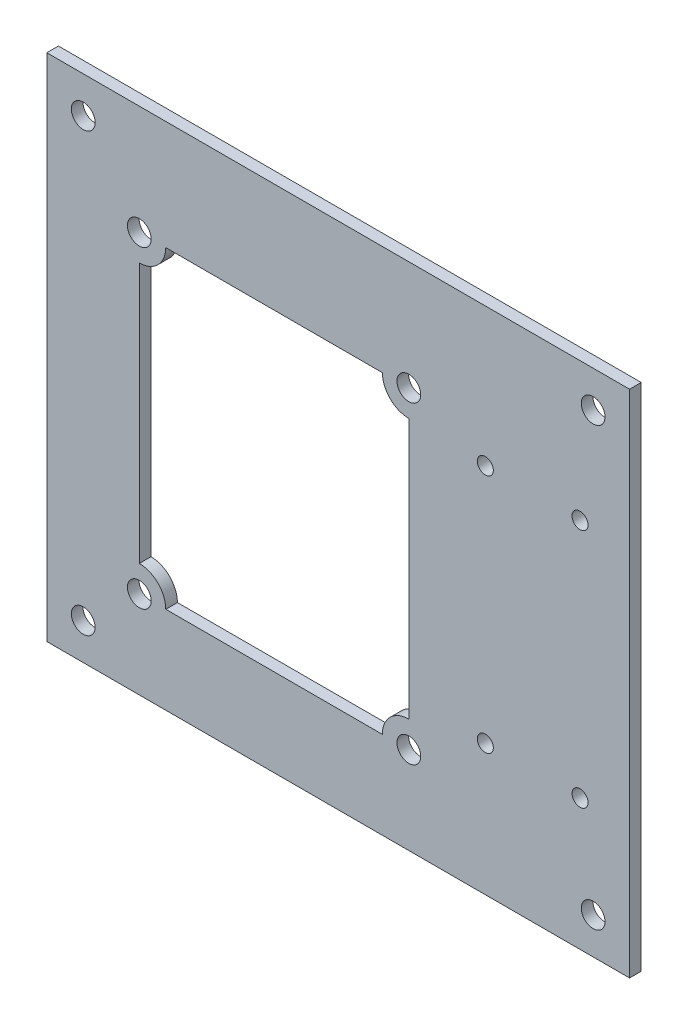
ISO-10303-21;
HEADER;
FILE_DESCRIPTION(('STEP AP214'),'2;1');
FILE_NAME('part.step','',(''),(''),'','','');
FILE_SCHEMA(('AUTOMOTIVE_DESIGN { 1 0 10303 214 1 1 1 1 }'));
ENDSEC;
DATA;
#1=APPLICATION_CONTEXT('core data for automotive mechanical design processes');
#2=APPLICATION_PROTOCOL_DEFINITION('international standard','automotive_design',2000,#1);
#3=PRODUCT_CONTEXT('',#1,'mechanical');
#4=PRODUCT('Part','Part','',(#3));
#5=PRODUCT_RELATED_PRODUCT_CATEGORY('part','',(#4));
#6=PRODUCT_DEFINITION_FORMATION('','',#4);
#7=PRODUCT_DEFINITION_CONTEXT('part definition',#1,'design');
#8=PRODUCT_DEFINITION('design','',#6,#7);
#9=PRODUCT_DEFINITION_SHAPE('','',#8);
#10=(LENGTH_UNIT() NAMED_UNIT(*) SI_UNIT(.MILLI.,.METRE.));
#11=(NAMED_UNIT(*) PLANE_ANGLE_UNIT() SI_UNIT($,.RADIAN.));
#12=(NAMED_UNIT(*) SI_UNIT($,.STERADIAN.) SOLID_ANGLE_UNIT());
#13=UNCERTAINTY_MEASURE_WITH_UNIT(LENGTH_MEASURE(1.E-05),#10,'distance_accuracy_value','');
#14=(GEOMETRIC_REPRESENTATION_CONTEXT(3) GLOBAL_UNCERTAINTY_ASSIGNED_CONTEXT((#13)) GLOBAL_UNIT_ASSIGNED_CONTEXT((#10,
#11,#12)) REPRESENTATION_CONTEXT('',''));
#15=CARTESIAN_POINT('',(0.,0.,0.));
#16=DIRECTION('',(0.,0.,1.));
#17=DIRECTION('',(1.,0.,0.));
#18=AXIS2_PLACEMENT_3D('',#15,#16,#17);
#19=CARTESIAN_POINT('',(75.,0.,1.6));
#20=DIRECTION('',(1.,0.,0.));
#21=DIRECTION('',(0.,1.,0.));
#22=AXIS2_PLACEMENT_3D('',#19,#20,#21);
#23=PLANE('',#22);
#24=DIRECTION('',(0.,-1.,0.));
#25=VECTOR('',#24,1.);
#26=CARTESIAN_POINT('',(75.,0.,0.));
#27=LINE('',#26,#25);
#28=CARTESIAN_POINT('',(75.,5.,0.));
#29=VERTEX_POINT('',#28);
#30=CARTESIAN_POINT('',(75.,-65.,0.));
#31=VERTEX_POINT('',#30);
#32=EDGE_CURVE('E256',#29,#31,#27,.T.);
#33=ORIENTED_EDGE('',*,*,#32,.F.);
#34=DIRECTION('',(0.,0.,-1.));
#35=VECTOR('',#34,1.);
#36=CARTESIAN_POINT('',(75.,5.,1.6));
#37=LINE('',#36,#35);
#38=CARTESIAN_POINT('',(75.,5.,1.6));
#39=VERTEX_POINT('',#38);
#40=EDGE_CURVE('E11',#39,#29,#37,.T.);
#41=ORIENTED_EDGE('',*,*,#40,.F.);
#42=DIRECTION('',(0.,-1.,0.));
#43=VECTOR('',#42,1.);
#44=CARTESIAN_POINT('',(75.,0.,1.6));
#45=LINE('',#44,#43);
#46=CARTESIAN_POINT('',(75.,-65.,1.6));
#47=VERTEX_POINT('',#46);
#48=EDGE_CURVE('E165',#39,#47,#45,.T.);
#49=ORIENTED_EDGE('',*,*,#48,.T.);
#50=DIRECTION('',(0.,0.,-1.));
#51=VECTOR('',#50,1.);
#52=CARTESIAN_POINT('',(75.,-65.,1.6));
#53=LINE('',#52,#51);
#54=EDGE_CURVE('E112',#47,#31,#53,.T.);
#55=ORIENTED_EDGE('',*,*,#54,.T.);
#56=EDGE_LOOP('',(#33,#41,#49,#55));
#57=FACE_BOUND('',#56,.T.);
#58=ADVANCED_FACE('F45',(#57),#23,.T.);
#59=CARTESIAN_POINT('',(0.,5.,1.6));
#60=DIRECTION('',(0.,1.,0.));
#61=DIRECTION('',(0.,0.,1.));
#62=AXIS2_PLACEMENT_3D('',#59,#60,#61);
#63=PLANE('',#62);
#64=DIRECTION('',(1.,0.,0.));
#65=VECTOR('',#64,1.);
#66=CARTESIAN_POINT('',(0.,5.,0.));
#67=LINE('',#66,#65);
#68=CARTESIAN_POINT('',(-5.,5.,0.));
#69=VERTEX_POINT('',#68);
#70=EDGE_CURVE('E152',#69,#29,#67,.T.);
#71=ORIENTED_EDGE('',*,*,#70,.F.);
#72=DIRECTION('',(0.,0.,-1.));
#73=VECTOR('',#72,1.);
#74=CARTESIAN_POINT('',(-5.,5.,1.6));
#75=LINE('',#74,#73);
#76=CARTESIAN_POINT('',(-5.,5.,1.6));
#77=VERTEX_POINT('',#76);
#78=EDGE_CURVE('E56',#77,#69,#75,.T.);
#79=ORIENTED_EDGE('',*,*,#78,.F.);
#80=DIRECTION('',(1.,0.,0.));
#81=VECTOR('',#80,1.);
#82=CARTESIAN_POINT('',(0.,5.,1.6));
#83=LINE('',#82,#81);
#84=EDGE_CURVE('E150',#77,#39,#83,.T.);
#85=ORIENTED_EDGE('',*,*,#84,.T.);
#86=ORIENTED_EDGE('',*,*,#40,.T.);
#87=EDGE_LOOP('',(#71,#79,#85,#86));
#88=FACE_BOUND('',#87,.T.);
#89=ADVANCED_FACE('F148',(#88),#63,.T.);
#90=CARTESIAN_POINT('',(-5.,0.,1.6));
#91=DIRECTION('',(1.,0.,0.));
#92=DIRECTION('',(0.,1.,0.));
#93=AXIS2_PLACEMENT_3D('',#90,#91,#92);
#94=PLANE('',#93);
#95=DIRECTION('',(0.,-1.,0.));
#96=VECTOR('',#95,1.);
#97=CARTESIAN_POINT('',(-5.,0.,0.));
#98=LINE('',#97,#96);
#99=CARTESIAN_POINT('',(-4.99999999999999,-65.,0.));
#100=VERTEX_POINT('',#99);
#101=EDGE_CURVE('E261',#69,#100,#98,.T.);
#102=ORIENTED_EDGE('',*,*,#101,.T.);
#103=DIRECTION('',(0.,0.,-1.));
#104=VECTOR('',#103,1.);
#105=CARTESIAN_POINT('',(-4.99999999999999,-65.,1.6));
#106=LINE('',#105,#104);
#107=CARTESIAN_POINT('',(-4.99999999999999,-65.,1.6));
#108=VERTEX_POINT('',#107);
#109=EDGE_CURVE('E156',#108,#100,#106,.T.);
#110=ORIENTED_EDGE('',*,*,#109,.F.);
#111=DIRECTION('',(0.,-1.,0.));
#112=VECTOR('',#111,1.);
#113=CARTESIAN_POINT('',(-5.,0.,1.6));
#114=LINE('',#113,#112);
#115=EDGE_CURVE('E159',#77,#108,#114,.T.);
#116=ORIENTED_EDGE('',*,*,#115,.F.);
#117=ORIENTED_EDGE('',*,*,#78,.T.);
#118=EDGE_LOOP('',(#102,#110,#116,#117));
#119=FACE_BOUND('',#118,.T.);
#120=ADVANCED_FACE('F160',(#119),#94,.F.);
#121=CARTESIAN_POINT('',(0.,-53.,1.6));
#122=DIRECTION('',(0.,1.,0.));
#123=DIRECTION('',(0.,0.,1.));
#124=AXIS2_PLACEMENT_3D('',#121,#122,#123);
#125=PLANE('',#124);
#126=DIRECTION('',(1.,0.,0.));
#127=VECTOR('',#126,1.);
#128=CARTESIAN_POINT('',(0.,-53.,0.));
#129=LINE('',#128,#127);
#130=CARTESIAN_POINT('',(11.33195,-53.,0.));
#131=VERTEX_POINT('',#130);
#132=CARTESIAN_POINT('',(41.06805,-53.,0.));
#133=VERTEX_POINT('',#132);
#134=EDGE_CURVE('E208',#131,#133,#129,.T.);
#135=ORIENTED_EDGE('',*,*,#134,.F.);
#136=DIRECTION('',(0.,0.,-1.));
#137=VECTOR('',#136,1.);
#138=CARTESIAN_POINT('',(11.33195,-53.,1.6));
#139=LINE('',#138,#137);
#140=CARTESIAN_POINT('',(11.33195,-53.,1.6));
#141=VERTEX_POINT('',#140);
#142=EDGE_CURVE('E49',#141,#131,#139,.T.);
#143=ORIENTED_EDGE('',*,*,#142,.F.);
#144=DIRECTION('',(1.,0.,0.));
#145=VECTOR('',#144,1.);
#146=CARTESIAN_POINT('',(0.,-53.,1.6));
#147=LINE('',#146,#145);
#148=CARTESIAN_POINT('',(41.06805,-53.,1.6));
#149=VERTEX_POINT('',#148);
#150=EDGE_CURVE('E325',#141,#149,#147,.T.);
#151=ORIENTED_EDGE('',*,*,#150,.T.);
#152=DIRECTION('',(0.,0.,-1.));
#153=VECTOR('',#152,1.);
#154=CARTESIAN_POINT('',(41.06805,-53.,1.6));
#155=LINE('',#154,#153);
#156=EDGE_CURVE('E191',#149,#133,#155,.T.);
#157=ORIENTED_EDGE('',*,*,#156,.T.);
#158=EDGE_LOOP('',(#135,#143,#151,#157));
#159=FACE_BOUND('',#158,.T.);
#160=ADVANCED_FACE('F323',(#159),#125,.T.);
#161=CARTESIAN_POINT('',(7.70000000000001,-53.,1.6));
#162=DIRECTION('',(0.,0.,-1.));
#163=DIRECTION('',(-1.,0.,0.));
#164=AXIS2_PLACEMENT_3D('',#161,#162,#163);
#165=CYLINDRICAL_SURFACE('',#164,3.63195);
#166=CARTESIAN_POINT('',(7.70000000000001,-53.,0.));
#167=DIRECTION('',(0.,0.,1.));
#168=DIRECTION('',(1.,0.,0.));
#169=AXIS2_PLACEMENT_3D('',#166,#167,#168);
#170=CIRCLE('',#169,3.63195);
#171=CARTESIAN_POINT('',(7.70000000000001,-49.36805,0.));
#172=VERTEX_POINT('',#171);
#173=EDGE_CURVE('E212',#131,#172,#170,.T.);
#174=ORIENTED_EDGE('',*,*,#173,.T.);
#175=DIRECTION('',(0.,0.,-1.));
#176=VECTOR('',#175,1.);
#177=CARTESIAN_POINT('',(7.70000000000001,-49.36805,1.6));
#178=LINE('',#177,#176);
#179=CARTESIAN_POINT('',(7.70000000000001,-49.36805,1.6));
#180=VERTEX_POINT('',#179);
#181=EDGE_CURVE('E307',#180,#172,#178,.T.);
#182=ORIENTED_EDGE('',*,*,#181,.F.);
#183=CARTESIAN_POINT('',(7.70000000000001,-53.,1.6));
#184=DIRECTION('',(0.,0.,1.));
#185=DIRECTION('',(1.,0.,0.));
#186=AXIS2_PLACEMENT_3D('',#183,#184,#185);
#187=CIRCLE('',#186,3.63195);
#188=EDGE_CURVE('E317',#141,#180,#187,.T.);
#189=ORIENTED_EDGE('',*,*,#188,.F.);
#190=ORIENTED_EDGE('',*,*,#142,.T.);
#191=EDGE_LOOP('',(#174,#182,#189,#190));
#192=FACE_BOUND('',#191,.T.);
#193=ADVANCED_FACE('F316',(#192),#165,.T.);
#194=CARTESIAN_POINT('',(7.7,0.,1.6));
#195=DIRECTION('',(1.,0.,0.));
#196=DIRECTION('',(0.,1.,0.));
#197=AXIS2_PLACEMENT_3D('',#194,#195,#196);
#198=PLANE('',#197);
#199=DIRECTION('',(0.,-1.,0.));
#200=VECTOR('',#199,1.);
#201=CARTESIAN_POINT('',(7.7,0.,0.));
#202=LINE('',#201,#200);
#203=CARTESIAN_POINT('',(7.7,-13.63195,0.));
#204=VERTEX_POINT('',#203);
#205=EDGE_CURVE('E216',#204,#172,#202,.T.);
#206=ORIENTED_EDGE('',*,*,#205,.F.);
#207=DIRECTION('',(0.,0.,-1.));
#208=VECTOR('',#207,1.);
#209=CARTESIAN_POINT('',(7.7,-13.63195,1.6));
#210=LINE('',#209,#208);
#211=CARTESIAN_POINT('',(7.7,-13.63195,1.6));
#212=VERTEX_POINT('',#211);
#213=EDGE_CURVE('E305',#212,#204,#210,.T.);
#214=ORIENTED_EDGE('',*,*,#213,.F.);
#215=DIRECTION('',(0.,-1.,0.));
#216=VECTOR('',#215,1.);
#217=CARTESIAN_POINT('',(7.7,0.,1.6));
#218=LINE('',#217,#216);
#219=EDGE_CURVE('E347',#212,#180,#218,.T.);
#220=ORIENTED_EDGE('',*,*,#219,.T.);
#221=ORIENTED_EDGE('',*,*,#181,.T.);
#222=EDGE_LOOP('',(#206,#214,#220,#221));
#223=FACE_BOUND('',#222,.T.);
#224=ADVANCED_FACE('F344',(#223),#198,.T.);
#225=CARTESIAN_POINT('',(7.7,-10.,1.6));
#226=DIRECTION('',(0.,0.,-1.));
#227=DIRECTION('',(-1.,0.,0.));
#228=AXIS2_PLACEMENT_3D('',#225,#226,#227);
#229=CYLINDRICAL_SURFACE('',#228,3.63195);
#230=CARTESIAN_POINT('',(7.7,-10.,0.));
#231=DIRECTION('',(0.,0.,1.));
#232=DIRECTION('',(1.,0.,0.));
#233=AXIS2_PLACEMENT_3D('',#230,#231,#232);
#234=CIRCLE('',#233,3.63195);
#235=CARTESIAN_POINT('',(11.33195,-10.,0.));
#236=VERTEX_POINT('',#235);
#237=EDGE_CURVE('E220',#204,#236,#234,.T.);
#238=ORIENTED_EDGE('',*,*,#237,.T.);
#239=DIRECTION('',(0.,0.,-1.));
#240=VECTOR('',#239,1.);
#241=CARTESIAN_POINT('',(11.33195,-10.,1.6));
#242=LINE('',#241,#240);
#243=CARTESIAN_POINT('',(11.33195,-10.,1.6));
#244=VERTEX_POINT('',#243);
#245=EDGE_CURVE('E301',#244,#236,#242,.T.);
#246=ORIENTED_EDGE('',*,*,#245,.F.);
#247=CARTESIAN_POINT('',(7.7,-10.,1.6));
#248=DIRECTION('',(0.,0.,1.));
#249=DIRECTION('',(1.,0.,0.));
#250=AXIS2_PLACEMENT_3D('',#247,#248,#249);
#251=CIRCLE('',#250,3.63195);
#252=EDGE_CURVE('E349',#212,#244,#251,.T.);
#253=ORIENTED_EDGE('',*,*,#252,.F.);
#254=ORIENTED_EDGE('',*,*,#213,.T.);
#255=EDGE_LOOP('',(#238,#246,#253,#254));
#256=FACE_BOUND('',#255,.T.);
#257=ADVANCED_FACE('F350',(#256),#229,.T.);
#258=CARTESIAN_POINT('',(0.,-10.,1.6));
#259=DIRECTION('',(0.,1.,0.));
#260=DIRECTION('',(0.,0.,1.));
#261=AXIS2_PLACEMENT_3D('',#258,#259,#260);
#262=PLANE('',#261);
#263=DIRECTION('',(1.,0.,0.));
#264=VECTOR('',#263,1.);
#265=CARTESIAN_POINT('',(0.,-10.,0.));
#266=LINE('',#265,#264);
#267=CARTESIAN_POINT('',(41.06805,-10.,0.));
#268=VERTEX_POINT('',#267);
#269=EDGE_CURVE('E224',#236,#268,#266,.T.);
#270=ORIENTED_EDGE('',*,*,#269,.T.);
#271=DIRECTION('',(0.,0.,-1.));
#272=VECTOR('',#271,1.);
#273=CARTESIAN_POINT('',(41.06805,-10.,1.6));
#274=LINE('',#273,#272);
#275=CARTESIAN_POINT('',(41.06805,-10.,1.6));
#276=VERTEX_POINT('',#275);
#277=EDGE_CURVE('E297',#276,#268,#274,.T.);
#278=ORIENTED_EDGE('',*,*,#277,.F.);
#279=DIRECTION('',(1.,0.,0.));
#280=VECTOR('',#279,1.);
#281=CARTESIAN_POINT('',(0.,-10.,1.6));
#282=LINE('',#281,#280);
#283=EDGE_CURVE('E353',#244,#276,#282,.T.);
#284=ORIENTED_EDGE('',*,*,#283,.F.);
#285=ORIENTED_EDGE('',*,*,#245,.T.);
#286=EDGE_LOOP('',(#270,#278,#284,#285));
#287=FACE_BOUND('',#286,.T.);
#288=ADVANCED_FACE('F341',(#287),#262,.F.);
#289=CARTESIAN_POINT('',(44.7,-10.,1.6));
#290=DIRECTION('',(0.,0.,-1.));
#291=DIRECTION('',(-1.,0.,0.));
#292=AXIS2_PLACEMENT_3D('',#289,#290,#291);
#293=CYLINDRICAL_SURFACE('',#292,3.63195);
#294=CARTESIAN_POINT('',(44.7,-10.,0.));
#295=DIRECTION('',(0.,0.,1.));
#296=DIRECTION('',(1.,0.,0.));
#297=AXIS2_PLACEMENT_3D('',#294,#295,#296);
#298=CIRCLE('',#297,3.63195);
#299=CARTESIAN_POINT('',(44.7,-13.63195,0.));
#300=VERTEX_POINT('',#299);
#301=EDGE_CURVE('E228',#268,#300,#298,.T.);
#302=ORIENTED_EDGE('',*,*,#301,.T.);
#303=DIRECTION('',(0.,0.,-1.));
#304=VECTOR('',#303,1.);
#305=CARTESIAN_POINT('',(44.7,-13.63195,1.6));
#306=LINE('',#305,#304);
#307=CARTESIAN_POINT('',(44.7,-13.63195,1.6));
#308=VERTEX_POINT('',#307);
#309=EDGE_CURVE('E293',#308,#300,#306,.T.);
#310=ORIENTED_EDGE('',*,*,#309,.F.);
#311=CARTESIAN_POINT('',(44.7,-10.,1.6));
#312=DIRECTION('',(0.,0.,1.));
#313=DIRECTION('',(1.,0.,0.));
#314=AXIS2_PLACEMENT_3D('',#311,#312,#313);
#315=CIRCLE('',#314,3.63195);
#316=EDGE_CURVE('E338',#276,#308,#315,.T.);
#317=ORIENTED_EDGE('',*,*,#316,.F.);
#318=ORIENTED_EDGE('',*,*,#277,.T.);
#319=EDGE_LOOP('',(#302,#310,#317,#318));
#320=FACE_BOUND('',#319,.T.);
#321=ADVANCED_FACE('F336',(#320),#293,.T.);
#322=CARTESIAN_POINT('',(44.7,0.,1.6));
#323=DIRECTION('',(1.,0.,0.));
#324=DIRECTION('',(0.,0.,-1.));
#325=AXIS2_PLACEMENT_3D('',#322,#323,#324);
#326=PLANE('',#325);
#327=DIRECTION('',(0.,-1.,0.));
#328=VECTOR('',#327,1.);
#329=CARTESIAN_POINT('',(44.7,0.,0.));
#330=LINE('',#329,#328);
#331=CARTESIAN_POINT('',(44.7,-49.36805,0.));
#332=VERTEX_POINT('',#331);
#333=EDGE_CURVE('E232',#300,#332,#330,.T.);
#334=ORIENTED_EDGE('',*,*,#333,.T.);
#335=DIRECTION('',(0.,0.,-1.));
#336=VECTOR('',#335,1.);
#337=CARTESIAN_POINT('',(44.7,-49.36805,1.6));
#338=LINE('',#337,#336);
#339=CARTESIAN_POINT('',(44.7,-49.36805,1.6));
#340=VERTEX_POINT('',#339);
#341=EDGE_CURVE('E289',#340,#332,#338,.T.);
#342=ORIENTED_EDGE('',*,*,#341,.F.);
#343=DIRECTION('',(0.,-1.,0.));
#344=VECTOR('',#343,1.);
#345=CARTESIAN_POINT('',(44.7,0.,1.6));
#346=LINE('',#345,#344);
#347=EDGE_CURVE('E333',#308,#340,#346,.T.);
#348=ORIENTED_EDGE('',*,*,#347,.F.);
#349=ORIENTED_EDGE('',*,*,#309,.T.);
#350=EDGE_LOOP('',(#334,#342,#348,#349));
#351=FACE_BOUND('',#350,.T.);
#352=ADVANCED_FACE('F331',(#351),#326,.F.);
#353=CARTESIAN_POINT('',(7.7,-10.,1.6));
#354=DIRECTION('',(0.,0.,-1.));
#355=DIRECTION('',(-1.,0.,0.));
#356=AXIS2_PLACEMENT_3D('',#353,#354,#355);
#357=CYLINDRICAL_SURFACE('',#356,1.63195);
#358=CARTESIAN_POINT('',(7.7,-10.,1.6));
#359=DIRECTION('',(0.,0.,1.));
#360=DIRECTION('',(1.,0.,0.));
#361=AXIS2_PLACEMENT_3D('',#358,#359,#360);
#362=CIRCLE('',#361,1.63195);
#363=CARTESIAN_POINT('',(9.33195000000001,-10.,1.6));
#364=VERTEX_POINT('',#363);
#365=EDGE_CURVE('E183',#364,#364,#362,.T.);
#366=ORIENTED_EDGE('',*,*,#365,.T.);
#367=EDGE_LOOP('',(#366));
#368=FACE_BOUND('',#367,.T.);
#369=CARTESIAN_POINT('',(7.7,-10.,0.));
#370=DIRECTION('',(0.,0.,1.));
#371=DIRECTION('',(1.,0.,0.));
#372=AXIS2_PLACEMENT_3D('',#369,#370,#371);
#373=CIRCLE('',#372,1.63195);
#374=CARTESIAN_POINT('',(9.33195000000001,-10.,0.));
#375=VERTEX_POINT('',#374);
#376=EDGE_CURVE('E274',#375,#375,#373,.T.);
#377=ORIENTED_EDGE('',*,*,#376,.F.);
#378=EDGE_LOOP('',(#377));
#379=FACE_BOUND('',#378,.T.);
#380=ADVANCED_FACE('F431',(#368,#379),#357,.F.);
#381=CARTESIAN_POINT('',(44.7,-10.,1.6));
#382=DIRECTION('',(0.,0.,-1.));
#383=DIRECTION('',(-1.,0.,0.));
#384=AXIS2_PLACEMENT_3D('',#381,#382,#383);
#385=CYLINDRICAL_SURFACE('',#384,1.63195);
#386=CARTESIAN_POINT('',(44.7,-10.,1.6));
#387=DIRECTION('',(0.,0.,1.));
#388=DIRECTION('',(1.,0.,0.));
#389=AXIS2_PLACEMENT_3D('',#386,#387,#388);
#390=CIRCLE('',#389,1.63195);
#391=CARTESIAN_POINT('',(46.33195,-10.,1.6));
#392=VERTEX_POINT('',#391);
#393=EDGE_CURVE('E179',#392,#392,#390,.T.);
#394=ORIENTED_EDGE('',*,*,#393,.T.);
#395=EDGE_LOOP('',(#394));
#396=FACE_BOUND('',#395,.T.);
#397=CARTESIAN_POINT('',(44.7,-10.,0.));
#398=DIRECTION('',(0.,0.,1.));
#399=DIRECTION('',(1.,0.,0.));
#400=AXIS2_PLACEMENT_3D('',#397,#398,#399);
#401=CIRCLE('',#400,1.63195);
#402=CARTESIAN_POINT('',(46.33195,-10.,0.));
#403=VERTEX_POINT('',#402);
#404=EDGE_CURVE('E270',#403,#403,#401,.T.);
#405=ORIENTED_EDGE('',*,*,#404,.F.);
#406=EDGE_LOOP('',(#405));
#407=FACE_BOUND('',#406,.T.);
#408=ADVANCED_FACE('F598',(#396,#407),#385,.F.);
#409=CARTESIAN_POINT('',(44.7,-53.,1.6));
#410=DIRECTION('',(0.,0.,-1.));
#411=DIRECTION('',(-1.,0.,0.));
#412=AXIS2_PLACEMENT_3D('',#409,#410,#411);
#413=CYLINDRICAL_SURFACE('',#412,1.63195);
#414=CARTESIAN_POINT('',(44.7,-53.,1.6));
#415=DIRECTION('',(0.,0.,1.));
#416=DIRECTION('',(1.,0.,0.));
#417=AXIS2_PLACEMENT_3D('',#414,#415,#416);
#418=CIRCLE('',#417,1.63195);
#419=CARTESIAN_POINT('',(46.33195,-53.,1.6));
#420=VERTEX_POINT('',#419);
#421=EDGE_CURVE('E175',#420,#420,#418,.T.);
#422=ORIENTED_EDGE('',*,*,#421,.T.);
#423=EDGE_LOOP('',(#422));
#424=FACE_BOUND('',#423,.T.);
#425=CARTESIAN_POINT('',(44.7,-53.,0.));
#426=DIRECTION('',(0.,0.,1.));
#427=DIRECTION('',(1.,0.,0.));
#428=AXIS2_PLACEMENT_3D('',#425,#426,#427);
#429=CIRCLE('',#428,1.63195);
#430=CARTESIAN_POINT('',(46.33195,-53.,0.));
#431=VERTEX_POINT('',#430);
#432=EDGE_CURVE('E266',#431,#431,#429,.T.);
#433=ORIENTED_EDGE('',*,*,#432,.F.);
#434=EDGE_LOOP('',(#433));
#435=FACE_BOUND('',#434,.T.);
#436=ADVANCED_FACE('F588',(#424,#435),#413,.F.);
#437=CARTESIAN_POINT('',(0.,-65.,1.6));
#438=DIRECTION('',(0.,1.,0.));
#439=DIRECTION('',(0.,0.,1.));
#440=AXIS2_PLACEMENT_3D('',#437,#438,#439);
#441=PLANE('',#440);
#442=DIRECTION('',(1.,0.,0.));
#443=VECTOR('',#442,1.);
#444=CARTESIAN_POINT('',(0.,-65.,0.));
#445=LINE('',#444,#443);
#446=EDGE_CURVE('E105',#100,#31,#445,.T.);
#447=ORIENTED_EDGE('',*,*,#446,.T.);
#448=ORIENTED_EDGE('',*,*,#54,.F.);
#449=DIRECTION('',(1.,0.,0.));
#450=VECTOR('',#449,1.);
#451=CARTESIAN_POINT('',(0.,-65.,1.6));
#452=LINE('',#451,#450);
#453=EDGE_CURVE('E65',#108,#47,#452,.T.);
#454=ORIENTED_EDGE('',*,*,#453,.F.);
#455=ORIENTED_EDGE('',*,*,#109,.T.);
#456=EDGE_LOOP('',(#447,#448,#454,#455));
#457=FACE_BOUND('',#456,.T.);
#458=ADVANCED_FACE('F414',(#457),#441,.F.);
#459=CARTESIAN_POINT('',(0.,0.,1.6));
#460=DIRECTION('',(0.,0.,-1.));
#461=DIRECTION('',(-1.,0.,0.));
#462=AXIS2_PLACEMENT_3D('',#459,#460,#461);
#463=CYLINDRICAL_SURFACE('',#462,1.63195);
#464=CARTESIAN_POINT('',(0.,0.,1.6));
#465=DIRECTION('',(0.,0.,1.));
#466=DIRECTION('',(1.,0.,0.));
#467=AXIS2_PLACEMENT_3D('',#464,#465,#466);
#468=CIRCLE('',#467,1.63195);
#469=CARTESIAN_POINT('',(1.63195,0.,1.6));
#470=VERTEX_POINT('',#469);
#471=EDGE_CURVE('E169',#470,#470,#468,.T.);
#472=ORIENTED_EDGE('',*,*,#471,.T.);
#473=EDGE_LOOP('',(#472));
#474=FACE_BOUND('',#473,.T.);
#475=CARTESIAN_POINT('',(0.,0.,0.));
#476=DIRECTION('',(0.,0.,1.));
#477=DIRECTION('',(1.,0.,0.));
#478=AXIS2_PLACEMENT_3D('',#475,#476,#477);
#479=CIRCLE('',#478,1.63195);
#480=CARTESIAN_POINT('',(1.63195,0.,0.));
#481=VERTEX_POINT('',#480);
#482=EDGE_CURVE('E252',#481,#481,#479,.T.);
#483=ORIENTED_EDGE('',*,*,#482,.F.);
#484=EDGE_LOOP('',(#483));
#485=FACE_BOUND('',#484,.T.);
#486=ADVANCED_FACE('F386',(#474,#485),#463,.F.);
#487=CARTESIAN_POINT('',(70.,0.,1.6));
#488=DIRECTION('',(0.,0.,-1.));
#489=DIRECTION('',(-1.,0.,0.));
#490=AXIS2_PLACEMENT_3D('',#487,#488,#489);
#491=CYLINDRICAL_SURFACE('',#490,1.63194999999999);
#492=CARTESIAN_POINT('',(70.,0.,1.6));
#493=DIRECTION('',(0.,0.,1.));
#494=DIRECTION('',(1.,0.,0.));
#495=AXIS2_PLACEMENT_3D('',#492,#493,#494);
#496=CIRCLE('',#495,1.63194999999999);
#497=CARTESIAN_POINT('',(71.63195,0.,1.6));
#498=VERTEX_POINT('',#497);
#499=EDGE_CURVE('E379',#498,#498,#496,.T.);
#500=ORIENTED_EDGE('',*,*,#499,.T.);
#501=EDGE_LOOP('',(#500));
#502=FACE_BOUND('',#501,.T.);
#503=CARTESIAN_POINT('',(70.,0.,0.));
#504=DIRECTION('',(0.,0.,1.));
#505=DIRECTION('',(1.,0.,0.));
#506=AXIS2_PLACEMENT_3D('',#503,#504,#505);
#507=CIRCLE('',#506,1.63194999999999);
#508=CARTESIAN_POINT('',(71.63195,0.,0.));
#509=VERTEX_POINT('',#508);
#510=EDGE_CURVE('E248',#509,#509,#507,.T.);
#511=ORIENTED_EDGE('',*,*,#510,.F.);
#512=EDGE_LOOP('',(#511));
#513=FACE_BOUND('',#512,.T.);
#514=ADVANCED_FACE('F413',(#502,#513),#491,.F.);
#515=CARTESIAN_POINT('',(70.,-60.,1.6));
#516=DIRECTION('',(0.,0.,-1.));
#517=DIRECTION('',(-1.,0.,0.));
#518=AXIS2_PLACEMENT_3D('',#515,#516,#517);
#519=CYLINDRICAL_SURFACE('',#518,1.63194999999999);
#520=CARTESIAN_POINT('',(70.,-60.,1.6));
#521=DIRECTION('',(0.,0.,1.));
#522=DIRECTION('',(1.,0.,0.));
#523=AXIS2_PLACEMENT_3D('',#520,#521,#522);
#524=CIRCLE('',#523,1.63194999999999);
#525=CARTESIAN_POINT('',(71.63195,-60.,1.6));
#526=VERTEX_POINT('',#525);
#527=EDGE_CURVE('E375',#526,#526,#524,.T.);
#528=ORIENTED_EDGE('',*,*,#527,.T.);
#529=EDGE_LOOP('',(#528));
#530=FACE_BOUND('',#529,.T.);
#531=CARTESIAN_POINT('',(70.,-60.,0.));
#532=DIRECTION('',(0.,0.,1.));
#533=DIRECTION('',(1.,0.,0.));
#534=AXIS2_PLACEMENT_3D('',#531,#532,#533);
#535=CIRCLE('',#534,1.63194999999999);
#536=CARTESIAN_POINT('',(71.63195,-60.,0.));
#537=VERTEX_POINT('',#536);
#538=EDGE_CURVE('E244',#537,#537,#535,.T.);
#539=ORIENTED_EDGE('',*,*,#538,.F.);
#540=EDGE_LOOP('',(#539));
#541=FACE_BOUND('',#540,.T.);
#542=ADVANCED_FACE('F417',(#530,#541),#519,.F.);
#543=CARTESIAN_POINT('',(0.,-60.,1.6));
#544=DIRECTION('',(0.,0.,-1.));
#545=DIRECTION('',(-1.,0.,0.));
#546=AXIS2_PLACEMENT_3D('',#543,#544,#545);
#547=CYLINDRICAL_SURFACE('',#546,1.63195);
#548=CARTESIAN_POINT('',(0.,-60.,1.6));
#549=DIRECTION('',(0.,0.,1.));
#550=DIRECTION('',(1.,0.,0.));
#551=AXIS2_PLACEMENT_3D('',#548,#549,#550);
#552=CIRCLE('',#551,1.63195);
#553=CARTESIAN_POINT('',(1.63195000000001,-60.,1.6));
#554=VERTEX_POINT('',#553);
#555=EDGE_CURVE('E371',#554,#554,#552,.T.);
#556=ORIENTED_EDGE('',*,*,#555,.T.);
#557=EDGE_LOOP('',(#556));
#558=FACE_BOUND('',#557,.T.);
#559=CARTESIAN_POINT('',(0.,-60.,0.));
#560=DIRECTION('',(0.,0.,1.));
#561=DIRECTION('',(1.,0.,0.));
#562=AXIS2_PLACEMENT_3D('',#559,#560,#561);
#563=CIRCLE('',#562,1.63195);
#564=CARTESIAN_POINT('',(1.63195000000001,-60.,0.));
#565=VERTEX_POINT('',#564);
#566=EDGE_CURVE('E240',#565,#565,#563,.T.);
#567=ORIENTED_EDGE('',*,*,#566,.F.);
#568=EDGE_LOOP('',(#567));
#569=FACE_BOUND('',#568,.T.);
#570=ADVANCED_FACE('F421',(#558,#569),#547,.F.);
#571=CARTESIAN_POINT('',(44.7,-53.,1.6));
#572=DIRECTION('',(0.,0.,-1.));
#573=DIRECTION('',(-1.,0.,0.));
#574=AXIS2_PLACEMENT_3D('',#571,#572,#573);
#575=CYLINDRICAL_SURFACE('',#574,3.63195);
#576=CARTESIAN_POINT('',(44.7,-53.,0.));
#577=DIRECTION('',(0.,0.,1.));
#578=DIRECTION('',(1.,0.,0.));
#579=AXIS2_PLACEMENT_3D('',#576,#577,#578);
#580=CIRCLE('',#579,3.63195);
#581=EDGE_CURVE('E236',#332,#133,#580,.T.);
#582=ORIENTED_EDGE('',*,*,#581,.T.);
#583=ORIENTED_EDGE('',*,*,#156,.F.);
#584=CARTESIAN_POINT('',(44.7,-53.,1.6));
#585=DIRECTION('',(0.,0.,1.));
#586=DIRECTION('',(1.,0.,0.));
#587=AXIS2_PLACEMENT_3D('',#584,#585,#586);
#588=CIRCLE('',#587,3.63195);
#589=EDGE_CURVE('E368',#340,#149,#588,.T.);
#590=ORIENTED_EDGE('',*,*,#589,.F.);
#591=ORIENTED_EDGE('',*,*,#341,.T.);
#592=EDGE_LOOP('',(#582,#583,#590,#591));
#593=FACE_BOUND('',#592,.T.);
#594=ADVANCED_FACE('F327',(#593),#575,.T.);
#595=CARTESIAN_POINT('',(55.2,-14.,1.6));
#596=DIRECTION('',(0.,0.,-1.));
#597=DIRECTION('',(-1.,0.,0.));
#598=AXIS2_PLACEMENT_3D('',#595,#596,#597);
#599=CYLINDRICAL_SURFACE('',#598,1.10000000000001);
#600=CARTESIAN_POINT('',(55.2,-14.,1.6));
#601=DIRECTION('',(0.,0.,1.));
#602=DIRECTION('',(1.,0.,0.));
#603=AXIS2_PLACEMENT_3D('',#600,#601,#602);
#604=CIRCLE('',#603,1.10000000000001);
#605=CARTESIAN_POINT('',(56.3,-14.,1.6));
#606=VERTEX_POINT('',#605);
#607=EDGE_CURVE('E475',#606,#606,#604,.T.);
#608=ORIENTED_EDGE('',*,*,#607,.T.);
#609=EDGE_LOOP('',(#608));
#610=FACE_BOUND('',#609,.T.);
#611=CARTESIAN_POINT('',(55.2,-14.,0.));
#612=DIRECTION('',(0.,0.,1.));
#613=DIRECTION('',(1.,0.,0.));
#614=AXIS2_PLACEMENT_3D('',#611,#612,#613);
#615=CIRCLE('',#614,1.10000000000001);
#616=CARTESIAN_POINT('',(56.3,-14.,0.));
#617=VERTEX_POINT('',#616);
#618=EDGE_CURVE('E204',#617,#617,#615,.T.);
#619=ORIENTED_EDGE('',*,*,#618,.F.);
#620=EDGE_LOOP('',(#619));
#621=FACE_BOUND('',#620,.T.);
#622=ADVANCED_FACE('F428',(#610,#621),#599,.F.);
#623=CARTESIAN_POINT('',(68.2,-14.,1.6));
#624=DIRECTION('',(0.,0.,-1.));
#625=DIRECTION('',(-1.,0.,0.));
#626=AXIS2_PLACEMENT_3D('',#623,#624,#625);
#627=CYLINDRICAL_SURFACE('',#626,1.10000000000001);
#628=CARTESIAN_POINT('',(68.2,-14.,1.6));
#629=DIRECTION('',(0.,0.,1.));
#630=DIRECTION('',(1.,0.,0.));
#631=AXIS2_PLACEMENT_3D('',#628,#629,#630);
#632=CIRCLE('',#631,1.10000000000001);
#633=CARTESIAN_POINT('',(69.3,-14.,1.6));
#634=VERTEX_POINT('',#633);
#635=EDGE_CURVE('E470',#634,#634,#632,.T.);
#636=ORIENTED_EDGE('',*,*,#635,.T.);
#637=EDGE_LOOP('',(#636));
#638=FACE_BOUND('',#637,.T.);
#639=CARTESIAN_POINT('',(68.2,-14.,0.));
#640=DIRECTION('',(0.,0.,1.));
#641=DIRECTION('',(1.,0.,0.));
#642=AXIS2_PLACEMENT_3D('',#639,#640,#641);
#643=CIRCLE('',#642,1.10000000000001);
#644=CARTESIAN_POINT('',(69.3,-14.,0.));
#645=VERTEX_POINT('',#644);
#646=EDGE_CURVE('E200',#645,#645,#643,.T.);
#647=ORIENTED_EDGE('',*,*,#646,.F.);
#648=EDGE_LOOP('',(#647));
#649=FACE_BOUND('',#648,.T.);
#650=ADVANCED_FACE('F446',(#638,#649),#627,.F.);
#651=CARTESIAN_POINT('',(68.2,-47.,1.6));
#652=DIRECTION('',(0.,0.,-1.));
#653=DIRECTION('',(-1.,0.,0.));
#654=AXIS2_PLACEMENT_3D('',#651,#652,#653);
#655=CYLINDRICAL_SURFACE('',#654,1.10000000000001);
#656=CARTESIAN_POINT('',(68.2,-47.,1.6));
#657=DIRECTION('',(0.,0.,1.));
#658=DIRECTION('',(1.,0.,0.));
#659=AXIS2_PLACEMENT_3D('',#656,#657,#658);
#660=CIRCLE('',#659,1.10000000000001);
#661=CARTESIAN_POINT('',(69.3,-47.,1.6));
#662=VERTEX_POINT('',#661);
#663=EDGE_CURVE('E460',#662,#662,#660,.T.);
#664=ORIENTED_EDGE('',*,*,#663,.T.);
#665=EDGE_LOOP('',(#664));
#666=FACE_BOUND('',#665,.T.);
#667=CARTESIAN_POINT('',(68.2,-47.,0.));
#668=DIRECTION('',(0.,0.,1.));
#669=DIRECTION('',(1.,0.,0.));
#670=AXIS2_PLACEMENT_3D('',#667,#668,#669);
#671=CIRCLE('',#670,1.10000000000001);
#672=CARTESIAN_POINT('',(69.3,-47.,0.));
#673=VERTEX_POINT('',#672);
#674=EDGE_CURVE('E196',#673,#673,#671,.T.);
#675=ORIENTED_EDGE('',*,*,#674,.F.);
#676=EDGE_LOOP('',(#675));
#677=FACE_BOUND('',#676,.T.);
#678=ADVANCED_FACE('F449',(#666,#677),#655,.F.);
#679=CARTESIAN_POINT('',(55.2,-47.,1.6));
#680=DIRECTION('',(0.,0.,-1.));
#681=DIRECTION('',(-1.,0.,0.));
#682=AXIS2_PLACEMENT_3D('',#679,#680,#681);
#683=CYLINDRICAL_SURFACE('',#682,1.1);
#684=CARTESIAN_POINT('',(55.2,-47.,1.6));
#685=DIRECTION('',(0.,0.,1.));
#686=DIRECTION('',(1.,0.,0.));
#687=AXIS2_PLACEMENT_3D('',#684,#685,#686);
#688=CIRCLE('',#687,1.1);
#689=CARTESIAN_POINT('',(56.3,-47.,1.6));
#690=VERTEX_POINT('',#689);
#691=EDGE_CURVE('E282',#690,#690,#688,.T.);
#692=ORIENTED_EDGE('',*,*,#691,.T.);
#693=EDGE_LOOP('',(#692));
#694=FACE_BOUND('',#693,.T.);
#695=CARTESIAN_POINT('',(55.2,-47.,0.));
#696=DIRECTION('',(0.,0.,1.));
#697=DIRECTION('',(1.,0.,0.));
#698=AXIS2_PLACEMENT_3D('',#695,#696,#697);
#699=CIRCLE('',#698,1.1);
#700=CARTESIAN_POINT('',(56.3,-47.,0.));
#701=VERTEX_POINT('',#700);
#702=EDGE_CURVE('E192',#701,#701,#699,.T.);
#703=ORIENTED_EDGE('',*,*,#702,.F.);
#704=EDGE_LOOP('',(#703));
#705=FACE_BOUND('',#704,.T.);
#706=ADVANCED_FACE('F47',(#694,#705),#683,.F.);
#707=CARTESIAN_POINT('',(7.70000000000001,-53.,1.6));
#708=DIRECTION('',(0.,0.,-1.));
#709=DIRECTION('',(-1.,0.,0.));
#710=AXIS2_PLACEMENT_3D('',#707,#708,#709);
#711=CYLINDRICAL_SURFACE('',#710,1.63195);
#712=CARTESIAN_POINT('',(7.70000000000001,-53.,1.6));
#713=DIRECTION('',(0.,0.,1.));
#714=DIRECTION('',(1.,0.,0.));
#715=AXIS2_PLACEMENT_3D('',#712,#713,#714);
#716=CIRCLE('',#715,1.63195);
#717=CARTESIAN_POINT('',(9.33195,-53.,1.6));
#718=VERTEX_POINT('',#717);
#719=EDGE_CURVE('E187',#718,#718,#716,.T.);
#720=ORIENTED_EDGE('',*,*,#719,.T.);
#721=EDGE_LOOP('',(#720));
#722=FACE_BOUND('',#721,.T.);
#723=CARTESIAN_POINT('',(7.70000000000001,-53.,0.));
#724=DIRECTION('',(0.,0.,1.));
#725=DIRECTION('',(1.,0.,0.));
#726=AXIS2_PLACEMENT_3D('',#723,#724,#725);
#727=CIRCLE('',#726,1.63195);
#728=CARTESIAN_POINT('',(9.33195,-53.,0.));
#729=VERTEX_POINT('',#728);
#730=EDGE_CURVE('E278',#729,#729,#727,.T.);
#731=ORIENTED_EDGE('',*,*,#730,.F.);
#732=EDGE_LOOP('',(#731));
#733=FACE_BOUND('',#732,.T.);
#734=ADVANCED_FACE('F390',(#722,#733),#711,.F.);
#735=CARTESIAN_POINT('',(0.,0.,1.6));
#736=DIRECTION('',(0.,0.,1.));
#737=DIRECTION('',(1.,0.,0.));
#738=AXIS2_PLACEMENT_3D('',#735,#736,#737);
#739=PLANE('',#738);
#740=ORIENTED_EDGE('',*,*,#691,.F.);
#741=EDGE_LOOP('',(#740));
#742=FACE_BOUND('',#741,.T.);
#743=ORIENTED_EDGE('',*,*,#663,.F.);
#744=EDGE_LOOP('',(#743));
#745=FACE_BOUND('',#744,.T.);
#746=ORIENTED_EDGE('',*,*,#635,.F.);
#747=EDGE_LOOP('',(#746));
#748=FACE_BOUND('',#747,.T.);
#749=ORIENTED_EDGE('',*,*,#607,.F.);
#750=EDGE_LOOP('',(#749));
#751=FACE_BOUND('',#750,.T.);
#752=ORIENTED_EDGE('',*,*,#150,.F.);
#753=ORIENTED_EDGE('',*,*,#188,.T.);
#754=ORIENTED_EDGE('',*,*,#219,.F.);
#755=ORIENTED_EDGE('',*,*,#252,.T.);
#756=ORIENTED_EDGE('',*,*,#283,.T.);
#757=ORIENTED_EDGE('',*,*,#316,.T.);
#758=ORIENTED_EDGE('',*,*,#347,.T.);
#759=ORIENTED_EDGE('',*,*,#589,.T.);
#760=EDGE_LOOP('',(#752,#753,#754,#755,#756,#757,#758,#759));
#761=FACE_BOUND('',#760,.T.);
#762=ORIENTED_EDGE('',*,*,#555,.F.);
#763=EDGE_LOOP('',(#762));
#764=FACE_BOUND('',#763,.T.);
#765=ORIENTED_EDGE('',*,*,#527,.F.);
#766=EDGE_LOOP('',(#765));
#767=FACE_BOUND('',#766,.T.);
#768=ORIENTED_EDGE('',*,*,#499,.F.);
#769=EDGE_LOOP('',(#768));
#770=FACE_BOUND('',#769,.T.);
#771=ORIENTED_EDGE('',*,*,#471,.F.);
#772=EDGE_LOOP('',(#771));
#773=FACE_BOUND('',#772,.T.);
#774=ORIENTED_EDGE('',*,*,#48,.F.);
#775=ORIENTED_EDGE('',*,*,#84,.F.);
#776=ORIENTED_EDGE('',*,*,#115,.T.);
#777=ORIENTED_EDGE('',*,*,#453,.T.);
#778=EDGE_LOOP('',(#774,#775,#776,#777));
#779=FACE_BOUND('',#778,.T.);
#780=ORIENTED_EDGE('',*,*,#421,.F.);
#781=EDGE_LOOP('',(#780));
#782=FACE_BOUND('',#781,.T.);
#783=ORIENTED_EDGE('',*,*,#393,.F.);
#784=EDGE_LOOP('',(#783));
#785=FACE_BOUND('',#784,.T.);
#786=ORIENTED_EDGE('',*,*,#365,.F.);
#787=EDGE_LOOP('',(#786));
#788=FACE_BOUND('',#787,.T.);
#789=ORIENTED_EDGE('',*,*,#719,.F.);
#790=EDGE_LOOP('',(#789));
#791=FACE_BOUND('',#790,.T.);
#792=ADVANCED_FACE('F163',(#742,#745,#748,#751,#761,#764,#767,#770,#773,#779,#782,#785,#788,
#791),#739,.T.);
#793=CARTESIAN_POINT('',(0.,0.,0.));
#794=DIRECTION('',(0.,0.,1.));
#795=DIRECTION('',(1.,0.,0.));
#796=AXIS2_PLACEMENT_3D('',#793,#794,#795);
#797=PLANE('',#796);
#798=ORIENTED_EDGE('',*,*,#702,.T.);
#799=EDGE_LOOP('',(#798));
#800=FACE_BOUND('',#799,.T.);
#801=ORIENTED_EDGE('',*,*,#674,.T.);
#802=EDGE_LOOP('',(#801));
#803=FACE_BOUND('',#802,.T.);
#804=ORIENTED_EDGE('',*,*,#646,.T.);
#805=EDGE_LOOP('',(#804));
#806=FACE_BOUND('',#805,.T.);
#807=ORIENTED_EDGE('',*,*,#618,.T.);
#808=EDGE_LOOP('',(#807));
#809=FACE_BOUND('',#808,.T.);
#810=ORIENTED_EDGE('',*,*,#134,.T.);
#811=ORIENTED_EDGE('',*,*,#581,.F.);
#812=ORIENTED_EDGE('',*,*,#333,.F.);
#813=ORIENTED_EDGE('',*,*,#301,.F.);
#814=ORIENTED_EDGE('',*,*,#269,.F.);
#815=ORIENTED_EDGE('',*,*,#237,.F.);
#816=ORIENTED_EDGE('',*,*,#205,.T.);
#817=ORIENTED_EDGE('',*,*,#173,.F.);
#818=EDGE_LOOP('',(#810,#811,#812,#813,#814,#815,#816,#817));
#819=FACE_BOUND('',#818,.T.);
#820=ORIENTED_EDGE('',*,*,#566,.T.);
#821=EDGE_LOOP('',(#820));
#822=FACE_BOUND('',#821,.T.);
#823=ORIENTED_EDGE('',*,*,#538,.T.);
#824=EDGE_LOOP('',(#823));
#825=FACE_BOUND('',#824,.T.);
#826=ORIENTED_EDGE('',*,*,#510,.T.);
#827=EDGE_LOOP('',(#826));
#828=FACE_BOUND('',#827,.T.);
#829=ORIENTED_EDGE('',*,*,#482,.T.);
#830=EDGE_LOOP('',(#829));
#831=FACE_BOUND('',#830,.T.);
#832=ORIENTED_EDGE('',*,*,#32,.T.);
#833=ORIENTED_EDGE('',*,*,#446,.F.);
#834=ORIENTED_EDGE('',*,*,#101,.F.);
#835=ORIENTED_EDGE('',*,*,#70,.T.);
#836=EDGE_LOOP('',(#832,#833,#834,#835));
#837=FACE_BOUND('',#836,.T.);
#838=ORIENTED_EDGE('',*,*,#432,.T.);
#839=EDGE_LOOP('',(#838));
#840=FACE_BOUND('',#839,.T.);
#841=ORIENTED_EDGE('',*,*,#404,.T.);
#842=EDGE_LOOP('',(#841));
#843=FACE_BOUND('',#842,.T.);
#844=ORIENTED_EDGE('',*,*,#376,.T.);
#845=EDGE_LOOP('',(#844));
#846=FACE_BOUND('',#845,.T.);
#847=ORIENTED_EDGE('',*,*,#730,.T.);
#848=EDGE_LOOP('',(#847));
#849=FACE_BOUND('',#848,.T.);
#850=ADVANCED_FACE('F320',(#800,#803,#806,#809,#819,#822,#825,#828,#831,#837,#840,#843,#846,
#849),#797,.F.);
#851=CLOSED_SHELL('',(#58,#89,#120,#160,#193,#224,#257,#288,#321,#352,#380,#408,#436,#458,#486,
#514,#542,#570,#594,#622,#650,#678,#706,#734,#792,#850));
#852=MANIFOLD_SOLID_BREP('B2',#851);
#853=ADVANCED_BREP_SHAPE_REPRESENTATION('',(#18,#852),#14);
#854=SHAPE_DEFINITION_REPRESENTATION(#9,#853);
ENDSEC;
END-ISO-10303-21;
